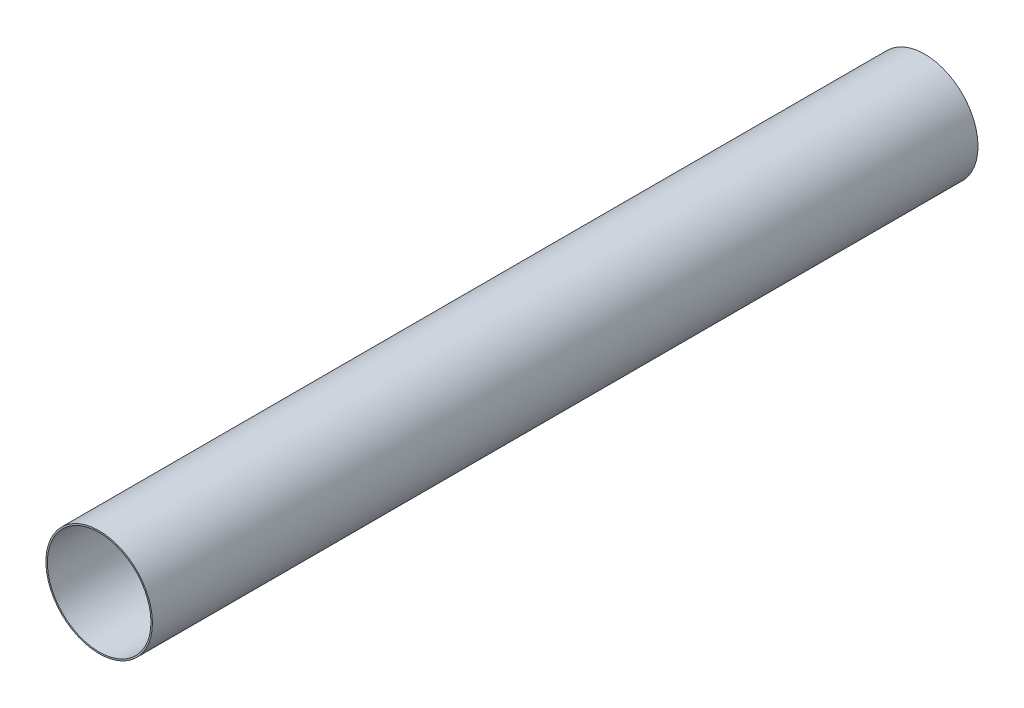
ISO-10303-21;
HEADER;
FILE_DESCRIPTION(('STEP AP214'),'2;1');
FILE_NAME('part.step','',(''),(''),'','','');
FILE_SCHEMA(('AUTOMOTIVE_DESIGN { 1 0 10303 214 1 1 1 1 }'));
ENDSEC;
DATA;
#1=APPLICATION_CONTEXT('core data for automotive mechanical design processes');
#2=APPLICATION_PROTOCOL_DEFINITION('international standard','automotive_design',2000,#1);
#3=PRODUCT_CONTEXT('',#1,'mechanical');
#4=PRODUCT('Part','Part','',(#3));
#5=PRODUCT_RELATED_PRODUCT_CATEGORY('part','',(#4));
#6=PRODUCT_DEFINITION_FORMATION('','',#4);
#7=PRODUCT_DEFINITION_CONTEXT('part definition',#1,'design');
#8=PRODUCT_DEFINITION('design','',#6,#7);
#9=PRODUCT_DEFINITION_SHAPE('','',#8);
#10=(LENGTH_UNIT() NAMED_UNIT(*) SI_UNIT(.MILLI.,.METRE.));
#11=(NAMED_UNIT(*) PLANE_ANGLE_UNIT() SI_UNIT($,.RADIAN.));
#12=(NAMED_UNIT(*) SI_UNIT($,.STERADIAN.) SOLID_ANGLE_UNIT());
#13=UNCERTAINTY_MEASURE_WITH_UNIT(LENGTH_MEASURE(1.E-05),#10,'distance_accuracy_value','');
#14=(GEOMETRIC_REPRESENTATION_CONTEXT(3) GLOBAL_UNCERTAINTY_ASSIGNED_CONTEXT((#13)) GLOBAL_UNIT_ASSIGNED_CONTEXT((#10,
#11,#12)) REPRESENTATION_CONTEXT('',''));
#15=CARTESIAN_POINT('',(0.,0.,0.));
#16=DIRECTION('',(0.,0.,1.));
#17=DIRECTION('',(1.,0.,0.));
#18=AXIS2_PLACEMENT_3D('',#15,#16,#17);
#19=CARTESIAN_POINT('',(0.,0.,787.4));
#20=DIRECTION('',(0.,0.,1.));
#21=DIRECTION('',(1.,0.,0.));
#22=AXIS2_PLACEMENT_3D('',#19,#20,#21);
#23=PLANE('',#22);
#24=CARTESIAN_POINT('',(0.,0.,787.4));
#25=DIRECTION('',(0.,0.,1.));
#26=DIRECTION('',(1.,0.,0.));
#27=AXIS2_PLACEMENT_3D('',#24,#25,#26);
#28=CIRCLE('',#27,50.8);
#29=CARTESIAN_POINT('',(50.8,0.,787.4));
#30=VERTEX_POINT('',#29);
#31=EDGE_CURVE('E10',#30,#30,#28,.T.);
#32=ORIENTED_EDGE('',*,*,#31,.T.);
#33=EDGE_LOOP('',(#32));
#34=FACE_BOUND('',#33,.T.);
#35=CARTESIAN_POINT('',(0.,0.,787.4));
#36=DIRECTION('',(0.,0.,1.));
#37=DIRECTION('',(1.,0.,0.));
#38=AXIS2_PLACEMENT_3D('',#35,#36,#37);
#39=CIRCLE('',#38,49.403);
#40=CARTESIAN_POINT('',(49.403,0.,787.4));
#41=VERTEX_POINT('',#40);
#42=EDGE_CURVE('E52',#41,#41,#39,.T.);
#43=ORIENTED_EDGE('',*,*,#42,.F.);
#44=EDGE_LOOP('',(#43));
#45=FACE_BOUND('',#44,.T.);
#46=ADVANCED_FACE('F41',(#34,#45),#23,.T.);
#47=CARTESIAN_POINT('',(0.,0.,0.));
#48=DIRECTION('',(0.,0.,1.));
#49=DIRECTION('',(1.,0.,0.));
#50=AXIS2_PLACEMENT_3D('',#47,#48,#49);
#51=PLANE('',#50);
#52=CARTESIAN_POINT('',(0.,0.,0.));
#53=DIRECTION('',(0.,0.,1.));
#54=DIRECTION('',(1.,0.,0.));
#55=AXIS2_PLACEMENT_3D('',#52,#53,#54);
#56=CIRCLE('',#55,50.8);
#57=CARTESIAN_POINT('',(50.8,0.,0.));
#58=VERTEX_POINT('',#57);
#59=EDGE_CURVE('E45',#58,#58,#56,.T.);
#60=ORIENTED_EDGE('',*,*,#59,.F.);
#61=EDGE_LOOP('',(#60));
#62=FACE_BOUND('',#61,.T.);
#63=CARTESIAN_POINT('',(0.,0.,0.));
#64=DIRECTION('',(0.,0.,1.));
#65=DIRECTION('',(1.,0.,0.));
#66=AXIS2_PLACEMENT_3D('',#63,#64,#65);
#67=CIRCLE('',#66,49.403);
#68=CARTESIAN_POINT('',(49.403,0.,0.));
#69=VERTEX_POINT('',#68);
#70=EDGE_CURVE('E54',#69,#69,#67,.T.);
#71=ORIENTED_EDGE('',*,*,#70,.T.);
#72=EDGE_LOOP('',(#71));
#73=FACE_BOUND('',#72,.T.);
#74=ADVANCED_FACE('F64',(#62,#73),#51,.F.);
#75=CARTESIAN_POINT('',(0.,0.,787.4));
#76=DIRECTION('',(0.,0.,-1.));
#77=DIRECTION('',(-1.,0.,0.));
#78=AXIS2_PLACEMENT_3D('',#75,#76,#77);
#79=CYLINDRICAL_SURFACE('',#78,50.8);
#80=ORIENTED_EDGE('',*,*,#31,.F.);
#81=EDGE_LOOP('',(#80));
#82=FACE_BOUND('',#81,.T.);
#83=ORIENTED_EDGE('',*,*,#59,.T.);
#84=EDGE_LOOP('',(#83));
#85=FACE_BOUND('',#84,.T.);
#86=ADVANCED_FACE('F43',(#82,#85),#79,.T.);
#87=CARTESIAN_POINT('',(0.,0.,787.4));
#88=DIRECTION('',(0.,0.,-1.));
#89=DIRECTION('',(-1.,0.,0.));
#90=AXIS2_PLACEMENT_3D('',#87,#88,#89);
#91=CYLINDRICAL_SURFACE('',#90,49.403);
#92=ORIENTED_EDGE('',*,*,#42,.T.);
#93=EDGE_LOOP('',(#92));
#94=FACE_BOUND('',#93,.T.);
#95=ORIENTED_EDGE('',*,*,#70,.F.);
#96=EDGE_LOOP('',(#95));
#97=FACE_BOUND('',#96,.T.);
#98=ADVANCED_FACE('F60',(#94,#97),#91,.F.);
#99=CLOSED_SHELL('',(#46,#74,#86,#98));
#100=MANIFOLD_SOLID_BREP('B2',#99);
#101=ADVANCED_BREP_SHAPE_REPRESENTATION('',(#18,#100),#14);
#102=SHAPE_DEFINITION_REPRESENTATION(#9,#101);
ENDSEC;
END-ISO-10303-21;
